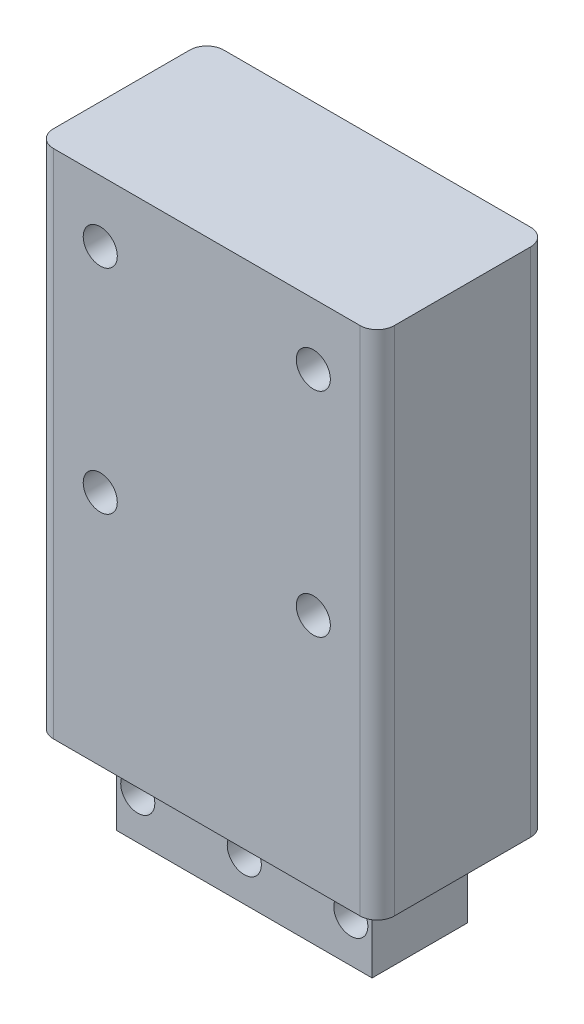
ISO-10303-21;
HEADER;
FILE_DESCRIPTION(('STEP AP214'),'2;1');
FILE_NAME('part.step','',(''),(''),'','','');
FILE_SCHEMA(('AUTOMOTIVE_DESIGN { 1 0 10303 214 1 1 1 1 }'));
ENDSEC;
DATA;
#1=APPLICATION_CONTEXT('core data for automotive mechanical design processes');
#2=APPLICATION_PROTOCOL_DEFINITION('international standard','automotive_design',2000,#1);
#3=PRODUCT_CONTEXT('',#1,'mechanical');
#4=PRODUCT('Part','Part','',(#3));
#5=PRODUCT_RELATED_PRODUCT_CATEGORY('part','',(#4));
#6=PRODUCT_DEFINITION_FORMATION('','',#4);
#7=PRODUCT_DEFINITION_CONTEXT('part definition',#1,'design');
#8=PRODUCT_DEFINITION('design','',#6,#7);
#9=PRODUCT_DEFINITION_SHAPE('','',#8);
#10=(LENGTH_UNIT() NAMED_UNIT(*) SI_UNIT(.MILLI.,.METRE.));
#11=(NAMED_UNIT(*) PLANE_ANGLE_UNIT() SI_UNIT($,.RADIAN.));
#12=(NAMED_UNIT(*) SI_UNIT($,.STERADIAN.) SOLID_ANGLE_UNIT());
#13=UNCERTAINTY_MEASURE_WITH_UNIT(LENGTH_MEASURE(1.E-05),#10,'distance_accuracy_value','');
#14=(GEOMETRIC_REPRESENTATION_CONTEXT(3) GLOBAL_UNCERTAINTY_ASSIGNED_CONTEXT((#13)) GLOBAL_UNIT_ASSIGNED_CONTEXT((#10,
#11,#12)) REPRESENTATION_CONTEXT('',''));
#15=CARTESIAN_POINT('',(0.,0.,0.));
#16=DIRECTION('',(0.,0.,1.));
#17=DIRECTION('',(1.,0.,0.));
#18=AXIS2_PLACEMENT_3D('',#15,#16,#17);
#19=CARTESIAN_POINT('',(-20.,-20.,-10.));
#20=DIRECTION('',(-1.,0.,0.));
#21=DIRECTION('',(0.,0.,1.));
#22=AXIS2_PLACEMENT_3D('',#19,#20,#21);
#23=PLANE('',#22);
#24=DIRECTION('',(0.,0.,1.));
#25=VECTOR('',#24,1.);
#26=CARTESIAN_POINT('',(-20.,-20.,-10.));
#27=LINE('',#26,#25);
#28=CARTESIAN_POINT('',(-20.,-20.,-8.));
#29=VERTEX_POINT('',#28);
#30=CARTESIAN_POINT('',(-20.,-20.,8.));
#31=VERTEX_POINT('',#30);
#32=EDGE_CURVE('E172',#29,#31,#27,.T.);
#33=ORIENTED_EDGE('',*,*,#32,.T.);
#34=DIRECTION('',(0.,1.,0.));
#35=VECTOR('',#34,1.);
#36=CARTESIAN_POINT('',(-20.,-20.,8.));
#37=LINE('',#36,#35);
#38=CARTESIAN_POINT('',(-20.,40.,8.));
#39=VERTEX_POINT('',#38);
#40=EDGE_CURVE('E11',#31,#39,#37,.T.);
#41=ORIENTED_EDGE('',*,*,#40,.T.);
#42=DIRECTION('',(0.,0.,1.));
#43=VECTOR('',#42,1.);
#44=CARTESIAN_POINT('',(-20.,40.,-9.99999999999999));
#45=LINE('',#44,#43);
#46=CARTESIAN_POINT('',(-20.,40.,-8.));
#47=VERTEX_POINT('',#46);
#48=EDGE_CURVE('E166',#47,#39,#45,.T.);
#49=ORIENTED_EDGE('',*,*,#48,.F.);
#50=DIRECTION('',(0.,1.,0.));
#51=VECTOR('',#50,1.);
#52=CARTESIAN_POINT('',(-20.,-20.,-8.));
#53=LINE('',#52,#51);
#54=EDGE_CURVE('E47',#47,#29,#53,.F.);
#55=ORIENTED_EDGE('',*,*,#54,.T.);
#56=EDGE_LOOP('',(#33,#41,#49,#55));
#57=FACE_BOUND('',#56,.T.);
#58=ADVANCED_FACE('F39',(#57),#23,.T.);
#59=CARTESIAN_POINT('',(20.,-20.,-10.));
#60=DIRECTION('',(0.,0.,-1.));
#61=DIRECTION('',(-1.,0.,0.));
#62=AXIS2_PLACEMENT_3D('',#59,#60,#61);
#63=PLANE('',#62);
#64=CARTESIAN_POINT('',(12.5,7.80084498848943,-10.));
#65=DIRECTION('',(0.,0.,-1.));
#66=DIRECTION('',(1.,0.,0.));
#67=AXIS2_PLACEMENT_3D('',#64,#65,#66);
#68=CIRCLE('',#67,2.00000000000001);
#69=CARTESIAN_POINT('',(14.5,7.80084498848943,-10.));
#70=VERTEX_POINT('',#69);
#71=EDGE_CURVE('E360',#70,#70,#68,.T.);
#72=ORIENTED_EDGE('',*,*,#71,.F.);
#73=EDGE_LOOP('',(#72));
#74=FACE_BOUND('',#73,.T.);
#75=CARTESIAN_POINT('',(12.5,32.8008449884894,-10.));
#76=DIRECTION('',(0.,0.,-1.));
#77=DIRECTION('',(1.,0.,0.));
#78=AXIS2_PLACEMENT_3D('',#75,#76,#77);
#79=CIRCLE('',#78,2.);
#80=CARTESIAN_POINT('',(14.5,32.8008449884894,-10.));
#81=VERTEX_POINT('',#80);
#82=EDGE_CURVE('E356',#81,#81,#79,.T.);
#83=ORIENTED_EDGE('',*,*,#82,.F.);
#84=EDGE_LOOP('',(#83));
#85=FACE_BOUND('',#84,.T.);
#86=CARTESIAN_POINT('',(-12.5,32.8008449884894,-10.));
#87=DIRECTION('',(0.,0.,-1.));
#88=DIRECTION('',(-1.,0.,0.));
#89=AXIS2_PLACEMENT_3D('',#86,#87,#88);
#90=CIRCLE('',#89,2.);
#91=CARTESIAN_POINT('',(-14.5,32.8008449884894,-10.));
#92=VERTEX_POINT('',#91);
#93=EDGE_CURVE('E353',#92,#92,#90,.T.);
#94=ORIENTED_EDGE('',*,*,#93,.F.);
#95=EDGE_LOOP('',(#94));
#96=FACE_BOUND('',#95,.T.);
#97=CARTESIAN_POINT('',(-12.5,7.80084498848943,-10.));
#98=DIRECTION('',(0.,0.,-1.));
#99=DIRECTION('',(-1.,0.,0.));
#100=AXIS2_PLACEMENT_3D('',#97,#98,#99);
#101=CIRCLE('',#100,2.00000000000001);
#102=CARTESIAN_POINT('',(-14.5,7.80084498848943,-10.));
#103=VERTEX_POINT('',#102);
#104=EDGE_CURVE('E201',#103,#103,#101,.T.);
#105=ORIENTED_EDGE('',*,*,#104,.F.);
#106=EDGE_LOOP('',(#105));
#107=FACE_BOUND('',#106,.T.);
#108=DIRECTION('',(-1.,0.,0.));
#109=VECTOR('',#108,1.);
#110=CARTESIAN_POINT('',(-20.,40.,-9.99999999999999));
#111=LINE('',#110,#109);
#112=CARTESIAN_POINT('',(18.,40.,-9.99999999999999));
#113=VERTEX_POINT('',#112);
#114=CARTESIAN_POINT('',(-18.,40.,-9.99999999999999));
#115=VERTEX_POINT('',#114);
#116=EDGE_CURVE('E158',#113,#115,#111,.T.);
#117=ORIENTED_EDGE('',*,*,#116,.F.);
#118=DIRECTION('',(0.,1.,0.));
#119=VECTOR('',#118,1.);
#120=CARTESIAN_POINT('',(18.,-20.,-10.));
#121=LINE('',#120,#119);
#122=CARTESIAN_POINT('',(18.,-20.,-10.));
#123=VERTEX_POINT('',#122);
#124=EDGE_CURVE('E224',#113,#123,#121,.F.);
#125=ORIENTED_EDGE('',*,*,#124,.T.);
#126=DIRECTION('',(-1.,0.,0.));
#127=VECTOR('',#126,1.);
#128=CARTESIAN_POINT('',(20.,-20.,-10.));
#129=LINE('',#128,#127);
#130=CARTESIAN_POINT('',(-18.,-20.,-10.));
#131=VERTEX_POINT('',#130);
#132=EDGE_CURVE('E180',#123,#131,#129,.T.);
#133=ORIENTED_EDGE('',*,*,#132,.T.);
#134=DIRECTION('',(0.,1.,0.));
#135=VECTOR('',#134,1.);
#136=CARTESIAN_POINT('',(-18.,-20.,-10.));
#137=LINE('',#136,#135);
#138=EDGE_CURVE('E221',#131,#115,#137,.T.);
#139=ORIENTED_EDGE('',*,*,#138,.T.);
#140=EDGE_LOOP('',(#117,#125,#133,#139));
#141=FACE_BOUND('',#140,.T.);
#142=ADVANCED_FACE('F249',(#74,#85,#96,#107,#141),#63,.T.);
#143=CARTESIAN_POINT('',(20.,-20.,-10.));
#144=DIRECTION('',(1.,0.,0.));
#145=DIRECTION('',(0.,0.,-1.));
#146=AXIS2_PLACEMENT_3D('',#143,#144,#145);
#147=PLANE('',#146);
#148=DIRECTION('',(0.,0.,-1.));
#149=VECTOR('',#148,1.);
#150=CARTESIAN_POINT('',(20.,-20.,-10.));
#151=LINE('',#150,#149);
#152=CARTESIAN_POINT('',(20.,-20.,7.99999999999999));
#153=VERTEX_POINT('',#152);
#154=CARTESIAN_POINT('',(20.,-20.,-8.00000000000001));
#155=VERTEX_POINT('',#154);
#156=EDGE_CURVE('E177',#153,#155,#151,.T.);
#157=ORIENTED_EDGE('',*,*,#156,.T.);
#158=DIRECTION('',(0.,1.,0.));
#159=VECTOR('',#158,1.);
#160=CARTESIAN_POINT('',(20.,-20.,-8.00000000000001));
#161=LINE('',#160,#159);
#162=CARTESIAN_POINT('',(20.,40.,-8.00000000000001));
#163=VERTEX_POINT('',#162);
#164=EDGE_CURVE('E210',#155,#163,#161,.T.);
#165=ORIENTED_EDGE('',*,*,#164,.T.);
#166=DIRECTION('',(0.,0.,-1.));
#167=VECTOR('',#166,1.);
#168=CARTESIAN_POINT('',(20.,40.,-9.99999999999999));
#169=LINE('',#168,#167);
#170=CARTESIAN_POINT('',(20.,40.,7.99999999999999));
#171=VERTEX_POINT('',#170);
#172=EDGE_CURVE('E155',#171,#163,#169,.T.);
#173=ORIENTED_EDGE('',*,*,#172,.F.);
#174=DIRECTION('',(0.,1.,0.));
#175=VECTOR('',#174,1.);
#176=CARTESIAN_POINT('',(20.,-20.,7.99999999999999));
#177=LINE('',#176,#175);
#178=EDGE_CURVE('E183',#171,#153,#177,.F.);
#179=ORIENTED_EDGE('',*,*,#178,.T.);
#180=EDGE_LOOP('',(#157,#165,#173,#179));
#181=FACE_BOUND('',#180,.T.);
#182=ADVANCED_FACE('F259',(#181),#147,.T.);
#183=CARTESIAN_POINT('',(20.,-20.,9.99999999999999));
#184=DIRECTION('',(0.,0.,1.));
#185=DIRECTION('',(1.,0.,0.));
#186=AXIS2_PLACEMENT_3D('',#183,#184,#185);
#187=PLANE('',#186);
#188=CARTESIAN_POINT('',(12.5,7.80084498848943,9.99999999999999));
#189=DIRECTION('',(0.,0.,1.));
#190=DIRECTION('',(1.,0.,0.));
#191=AXIS2_PLACEMENT_3D('',#188,#189,#190);
#192=CIRCLE('',#191,2.00000000000001);
#193=CARTESIAN_POINT('',(14.5,7.80084498848943,9.99999999999999));
#194=VERTEX_POINT('',#193);
#195=EDGE_CURVE('E188',#194,#194,#192,.T.);
#196=ORIENTED_EDGE('',*,*,#195,.F.);
#197=EDGE_LOOP('',(#196));
#198=FACE_BOUND('',#197,.T.);
#199=CARTESIAN_POINT('',(12.5,32.8008449884894,9.99999999999999));
#200=DIRECTION('',(0.,0.,1.));
#201=DIRECTION('',(1.,0.,0.));
#202=AXIS2_PLACEMENT_3D('',#199,#200,#201);
#203=CIRCLE('',#202,2.);
#204=CARTESIAN_POINT('',(14.5,32.8008449884894,9.99999999999999));
#205=VERTEX_POINT('',#204);
#206=EDGE_CURVE('E204',#205,#205,#203,.T.);
#207=ORIENTED_EDGE('',*,*,#206,.F.);
#208=EDGE_LOOP('',(#207));
#209=FACE_BOUND('',#208,.T.);
#210=CARTESIAN_POINT('',(-12.5,32.8008449884894,10.));
#211=DIRECTION('',(0.,0.,1.));
#212=DIRECTION('',(1.,0.,0.));
#213=AXIS2_PLACEMENT_3D('',#210,#211,#212);
#214=CIRCLE('',#213,2.);
#215=CARTESIAN_POINT('',(-10.5,32.8008449884894,10.));
#216=VERTEX_POINT('',#215);
#217=EDGE_CURVE('E200',#216,#216,#214,.T.);
#218=ORIENTED_EDGE('',*,*,#217,.F.);
#219=EDGE_LOOP('',(#218));
#220=FACE_BOUND('',#219,.T.);
#221=CARTESIAN_POINT('',(-12.5,7.80084498848943,10.));
#222=DIRECTION('',(0.,0.,1.));
#223=DIRECTION('',(1.,0.,0.));
#224=AXIS2_PLACEMENT_3D('',#221,#222,#223);
#225=CIRCLE('',#224,2.00000000000001);
#226=CARTESIAN_POINT('',(-10.5,7.80084498848943,10.));
#227=VERTEX_POINT('',#226);
#228=EDGE_CURVE('E197',#227,#227,#225,.T.);
#229=ORIENTED_EDGE('',*,*,#228,.F.);
#230=EDGE_LOOP('',(#229));
#231=FACE_BOUND('',#230,.T.);
#232=DIRECTION('',(1.,0.,0.));
#233=VECTOR('',#232,1.);
#234=CARTESIAN_POINT('',(20.,-20.,9.99999999999999));
#235=LINE('',#234,#233);
#236=CARTESIAN_POINT('',(-18.,-20.,10.));
#237=VERTEX_POINT('',#236);
#238=CARTESIAN_POINT('',(18.,-20.,9.99999999999999));
#239=VERTEX_POINT('',#238);
#240=EDGE_CURVE('E175',#237,#239,#235,.T.);
#241=ORIENTED_EDGE('',*,*,#240,.T.);
#242=DIRECTION('',(0.,1.,0.));
#243=VECTOR('',#242,1.);
#244=CARTESIAN_POINT('',(18.,-20.,9.99999999999999));
#245=LINE('',#244,#243);
#246=CARTESIAN_POINT('',(18.,40.,9.99999999999999));
#247=VERTEX_POINT('',#246);
#248=EDGE_CURVE('E234',#239,#247,#245,.T.);
#249=ORIENTED_EDGE('',*,*,#248,.T.);
#250=DIRECTION('',(1.,0.,0.));
#251=VECTOR('',#250,1.);
#252=CARTESIAN_POINT('',(-20.,40.,9.99999999999999));
#253=LINE('',#252,#251);
#254=CARTESIAN_POINT('',(-18.,40.,9.99999999999999));
#255=VERTEX_POINT('',#254);
#256=EDGE_CURVE('E169',#255,#247,#253,.T.);
#257=ORIENTED_EDGE('',*,*,#256,.F.);
#258=DIRECTION('',(0.,1.,0.));
#259=VECTOR('',#258,1.);
#260=CARTESIAN_POINT('',(-18.,-20.,10.));
#261=LINE('',#260,#259);
#262=EDGE_CURVE('E61',#255,#237,#261,.F.);
#263=ORIENTED_EDGE('',*,*,#262,.T.);
#264=EDGE_LOOP('',(#241,#249,#257,#263));
#265=FACE_BOUND('',#264,.T.);
#266=ADVANCED_FACE('F264',(#198,#209,#220,#231,#265),#187,.T.);
#267=CARTESIAN_POINT('',(0.,-20.,0.));
#268=DIRECTION('',(0.,-1.,0.));
#269=DIRECTION('',(0.,0.,-1.));
#270=AXIS2_PLACEMENT_3D('',#267,#268,#269);
#271=PLANE('',#270);
#272=DIRECTION('',(-1.,0.,0.));
#273=VECTOR('',#272,1.);
#274=CARTESIAN_POINT('',(15.,-20.,5.6));
#275=LINE('',#274,#273);
#276=CARTESIAN_POINT('',(15.,-20.,5.6));
#277=VERTEX_POINT('',#276);
#278=CARTESIAN_POINT('',(-15.,-20.,5.6));
#279=VERTEX_POINT('',#278);
#280=EDGE_CURVE('E154',#277,#279,#275,.T.);
#281=ORIENTED_EDGE('',*,*,#280,.F.);
#282=DIRECTION('',(0.,0.,1.));
#283=VECTOR('',#282,1.);
#284=CARTESIAN_POINT('',(15.,-20.,-5.6));
#285=LINE('',#284,#283);
#286=CARTESIAN_POINT('',(15.,-20.,-5.6));
#287=VERTEX_POINT('',#286);
#288=EDGE_CURVE('E151',#287,#277,#285,.T.);
#289=ORIENTED_EDGE('',*,*,#288,.F.);
#290=DIRECTION('',(1.,0.,0.));
#291=VECTOR('',#290,1.);
#292=CARTESIAN_POINT('',(-15.,-20.,-5.6));
#293=LINE('',#292,#291);
#294=CARTESIAN_POINT('',(-15.,-20.,-5.6));
#295=VERTEX_POINT('',#294);
#296=EDGE_CURVE('E374',#295,#287,#293,.T.);
#297=ORIENTED_EDGE('',*,*,#296,.F.);
#298=DIRECTION('',(0.,0.,-1.));
#299=VECTOR('',#298,1.);
#300=CARTESIAN_POINT('',(-15.,-20.,5.6));
#301=LINE('',#300,#299);
#302=EDGE_CURVE('E372',#279,#295,#301,.T.);
#303=ORIENTED_EDGE('',*,*,#302,.F.);
#304=EDGE_LOOP('',(#281,#289,#297,#303));
#305=FACE_BOUND('',#304,.T.);
#306=ORIENTED_EDGE('',*,*,#132,.F.);
#307=CARTESIAN_POINT('',(18.,-20.,-8.00000000000001));
#308=DIRECTION('',(0.,-1.,0.));
#309=DIRECTION('',(0.,0.,-1.));
#310=AXIS2_PLACEMENT_3D('',#307,#308,#309);
#311=CIRCLE('',#310,2.);
#312=EDGE_CURVE('E231',#123,#155,#311,.T.);
#313=ORIENTED_EDGE('',*,*,#312,.T.);
#314=ORIENTED_EDGE('',*,*,#156,.F.);
#315=CARTESIAN_POINT('',(18.,-20.,7.99999999999999));
#316=DIRECTION('',(0.,-1.,0.));
#317=DIRECTION('',(0.,0.,-1.));
#318=AXIS2_PLACEMENT_3D('',#315,#316,#317);
#319=CIRCLE('',#318,2.);
#320=EDGE_CURVE('E54',#153,#239,#319,.T.);
#321=ORIENTED_EDGE('',*,*,#320,.T.);
#322=ORIENTED_EDGE('',*,*,#240,.F.);
#323=CARTESIAN_POINT('',(-18.,-20.,8.));
#324=DIRECTION('',(0.,-1.,0.));
#325=DIRECTION('',(0.,0.,-1.));
#326=AXIS2_PLACEMENT_3D('',#323,#324,#325);
#327=CIRCLE('',#326,2.);
#328=EDGE_CURVE('E228',#237,#31,#327,.T.);
#329=ORIENTED_EDGE('',*,*,#328,.T.);
#330=ORIENTED_EDGE('',*,*,#32,.F.);
#331=CARTESIAN_POINT('',(-18.,-20.,-8.));
#332=DIRECTION('',(0.,-1.,0.));
#333=DIRECTION('',(0.,0.,-1.));
#334=AXIS2_PLACEMENT_3D('',#331,#332,#333);
#335=CIRCLE('',#334,2.);
#336=EDGE_CURVE('E226',#29,#131,#335,.T.);
#337=ORIENTED_EDGE('',*,*,#336,.T.);
#338=EDGE_LOOP('',(#306,#313,#314,#321,#322,#329,#330,#337));
#339=FACE_BOUND('',#338,.T.);
#340=ADVANCED_FACE('F244',(#305,#339),#271,.T.);
#341=CARTESIAN_POINT('',(0.,40.,0.));
#342=DIRECTION('',(0.,1.,0.));
#343=DIRECTION('',(0.,0.,1.));
#344=AXIS2_PLACEMENT_3D('',#341,#342,#343);
#345=PLANE('',#344);
#346=ORIENTED_EDGE('',*,*,#172,.T.);
#347=CARTESIAN_POINT('',(18.,40.,-8.00000000000001));
#348=DIRECTION('',(0.,1.,0.));
#349=DIRECTION('',(0.,0.,1.));
#350=AXIS2_PLACEMENT_3D('',#347,#348,#349);
#351=CIRCLE('',#350,2.);
#352=EDGE_CURVE('E219',#163,#113,#351,.T.);
#353=ORIENTED_EDGE('',*,*,#352,.T.);
#354=ORIENTED_EDGE('',*,*,#116,.T.);
#355=CARTESIAN_POINT('',(-18.,40.,-8.));
#356=DIRECTION('',(0.,1.,0.));
#357=DIRECTION('',(0.,0.,1.));
#358=AXIS2_PLACEMENT_3D('',#355,#356,#357);
#359=CIRCLE('',#358,2.);
#360=EDGE_CURVE('E213',#115,#47,#359,.T.);
#361=ORIENTED_EDGE('',*,*,#360,.T.);
#362=ORIENTED_EDGE('',*,*,#48,.T.);
#363=CARTESIAN_POINT('',(-18.,40.,8.));
#364=DIRECTION('',(0.,1.,0.));
#365=DIRECTION('',(0.,0.,1.));
#366=AXIS2_PLACEMENT_3D('',#363,#364,#365);
#367=CIRCLE('',#366,2.);
#368=EDGE_CURVE('E215',#39,#255,#367,.T.);
#369=ORIENTED_EDGE('',*,*,#368,.T.);
#370=ORIENTED_EDGE('',*,*,#256,.T.);
#371=CARTESIAN_POINT('',(18.,40.,7.99999999999999));
#372=DIRECTION('',(0.,1.,0.));
#373=DIRECTION('',(0.,0.,1.));
#374=AXIS2_PLACEMENT_3D('',#371,#372,#373);
#375=CIRCLE('',#374,2.);
#376=EDGE_CURVE('E217',#247,#171,#375,.T.);
#377=ORIENTED_EDGE('',*,*,#376,.T.);
#378=EDGE_LOOP('',(#346,#353,#354,#361,#362,#369,#370,#377));
#379=FACE_BOUND('',#378,.T.);
#380=ADVANCED_FACE('F252',(#379),#345,.T.);
#381=CARTESIAN_POINT('',(15.,-30.,5.6));
#382=DIRECTION('',(0.,0.,-1.));
#383=DIRECTION('',(-1.,0.,0.));
#384=AXIS2_PLACEMENT_3D('',#381,#382,#383);
#385=PLANE('',#384);
#386=CARTESIAN_POINT('',(12.5,-25.,5.6));
#387=DIRECTION('',(0.,0.,-1.));
#388=DIRECTION('',(-1.,0.,0.));
#389=AXIS2_PLACEMENT_3D('',#386,#387,#388);
#390=CIRCLE('',#389,2.);
#391=CARTESIAN_POINT('',(10.5,-25.,5.6));
#392=VERTEX_POINT('',#391);
#393=EDGE_CURVE('E196',#392,#392,#390,.T.);
#394=ORIENTED_EDGE('',*,*,#393,.T.);
#395=EDGE_LOOP('',(#394));
#396=FACE_BOUND('',#395,.T.);
#397=CARTESIAN_POINT('',(-12.5,-25.,5.6));
#398=DIRECTION('',(0.,0.,-1.));
#399=DIRECTION('',(-1.,0.,0.));
#400=AXIS2_PLACEMENT_3D('',#397,#398,#399);
#401=CIRCLE('',#400,2.);
#402=CARTESIAN_POINT('',(-14.5,-25.,5.6));
#403=VERTEX_POINT('',#402);
#404=EDGE_CURVE('E192',#403,#403,#401,.T.);
#405=ORIENTED_EDGE('',*,*,#404,.T.);
#406=EDGE_LOOP('',(#405));
#407=FACE_BOUND('',#406,.T.);
#408=CARTESIAN_POINT('',(0.,-25.,5.6));
#409=DIRECTION('',(0.,0.,-1.));
#410=DIRECTION('',(-1.,0.,0.));
#411=AXIS2_PLACEMENT_3D('',#408,#409,#410);
#412=CIRCLE('',#411,2.);
#413=CARTESIAN_POINT('',(-2.,-25.,5.6));
#414=VERTEX_POINT('',#413);
#415=EDGE_CURVE('E187',#414,#414,#412,.T.);
#416=ORIENTED_EDGE('',*,*,#415,.T.);
#417=EDGE_LOOP('',(#416));
#418=FACE_BOUND('',#417,.T.);
#419=ORIENTED_EDGE('',*,*,#280,.T.);
#420=DIRECTION('',(0.,1.,0.));
#421=VECTOR('',#420,1.);
#422=CARTESIAN_POINT('',(-15.,-30.,5.6));
#423=LINE('',#422,#421);
#424=CARTESIAN_POINT('',(-15.,-30.,5.6));
#425=VERTEX_POINT('',#424);
#426=EDGE_CURVE('E135',#425,#279,#423,.T.);
#427=ORIENTED_EDGE('',*,*,#426,.F.);
#428=DIRECTION('',(-1.,0.,0.));
#429=VECTOR('',#428,1.);
#430=CARTESIAN_POINT('',(15.,-30.,5.6));
#431=LINE('',#430,#429);
#432=CARTESIAN_POINT('',(15.,-30.,5.6));
#433=VERTEX_POINT('',#432);
#434=EDGE_CURVE('E142',#433,#425,#431,.T.);
#435=ORIENTED_EDGE('',*,*,#434,.F.);
#436=DIRECTION('',(0.,1.,0.));
#437=VECTOR('',#436,1.);
#438=CARTESIAN_POINT('',(15.,-30.,5.6));
#439=LINE('',#438,#437);
#440=EDGE_CURVE('E370',#433,#277,#439,.T.);
#441=ORIENTED_EDGE('',*,*,#440,.T.);
#442=EDGE_LOOP('',(#419,#427,#435,#441));
#443=FACE_BOUND('',#442,.T.);
#444=ADVANCED_FACE('F153',(#396,#407,#418,#443),#385,.F.);
#445=CARTESIAN_POINT('',(-15.,-30.,5.6));
#446=DIRECTION('',(1.,0.,0.));
#447=DIRECTION('',(0.,0.,-1.));
#448=AXIS2_PLACEMENT_3D('',#445,#446,#447);
#449=PLANE('',#448);
#450=ORIENTED_EDGE('',*,*,#302,.T.);
#451=DIRECTION('',(0.,1.,0.));
#452=VECTOR('',#451,1.);
#453=CARTESIAN_POINT('',(-15.,-30.,-5.6));
#454=LINE('',#453,#452);
#455=CARTESIAN_POINT('',(-15.,-30.,-5.6));
#456=VERTEX_POINT('',#455);
#457=EDGE_CURVE('E138',#456,#295,#454,.T.);
#458=ORIENTED_EDGE('',*,*,#457,.F.);
#459=DIRECTION('',(0.,0.,-1.));
#460=VECTOR('',#459,1.);
#461=CARTESIAN_POINT('',(-15.,-30.,5.6));
#462=LINE('',#461,#460);
#463=EDGE_CURVE('E130',#425,#456,#462,.T.);
#464=ORIENTED_EDGE('',*,*,#463,.F.);
#465=ORIENTED_EDGE('',*,*,#426,.T.);
#466=EDGE_LOOP('',(#450,#458,#464,#465));
#467=FACE_BOUND('',#466,.T.);
#468=ADVANCED_FACE('F133',(#467),#449,.F.);
#469=CARTESIAN_POINT('',(-15.,-30.,-5.6));
#470=DIRECTION('',(0.,0.,1.));
#471=DIRECTION('',(1.,0.,0.));
#472=AXIS2_PLACEMENT_3D('',#469,#470,#471);
#473=PLANE('',#472);
#474=CARTESIAN_POINT('',(12.5,-25.,-5.6));
#475=DIRECTION('',(0.,0.,1.));
#476=DIRECTION('',(1.,0.,0.));
#477=AXIS2_PLACEMENT_3D('',#474,#475,#476);
#478=CIRCLE('',#477,2.);
#479=CARTESIAN_POINT('',(14.5,-25.,-5.6));
#480=VERTEX_POINT('',#479);
#481=EDGE_CURVE('E193',#480,#480,#478,.T.);
#482=ORIENTED_EDGE('',*,*,#481,.T.);
#483=EDGE_LOOP('',(#482));
#484=FACE_BOUND('',#483,.T.);
#485=CARTESIAN_POINT('',(-12.5,-25.,-5.6));
#486=DIRECTION('',(0.,0.,1.));
#487=DIRECTION('',(1.,0.,0.));
#488=AXIS2_PLACEMENT_3D('',#485,#486,#487);
#489=CIRCLE('',#488,2.);
#490=CARTESIAN_POINT('',(-10.5,-25.,-5.6));
#491=VERTEX_POINT('',#490);
#492=EDGE_CURVE('E189',#491,#491,#489,.T.);
#493=ORIENTED_EDGE('',*,*,#492,.T.);
#494=EDGE_LOOP('',(#493));
#495=FACE_BOUND('',#494,.T.);
#496=CARTESIAN_POINT('',(0.,-25.,-5.6));
#497=DIRECTION('',(0.,0.,1.));
#498=DIRECTION('',(1.,0.,0.));
#499=AXIS2_PLACEMENT_3D('',#496,#497,#498);
#500=CIRCLE('',#499,2.);
#501=CARTESIAN_POINT('',(2.,-25.,-5.6));
#502=VERTEX_POINT('',#501);
#503=EDGE_CURVE('E184',#502,#502,#500,.T.);
#504=ORIENTED_EDGE('',*,*,#503,.T.);
#505=EDGE_LOOP('',(#504));
#506=FACE_BOUND('',#505,.T.);
#507=ORIENTED_EDGE('',*,*,#296,.T.);
#508=DIRECTION('',(0.,1.,0.));
#509=VECTOR('',#508,1.);
#510=CARTESIAN_POINT('',(15.,-30.,-5.6));
#511=LINE('',#510,#509);
#512=CARTESIAN_POINT('',(15.,-30.,-5.6));
#513=VERTEX_POINT('',#512);
#514=EDGE_CURVE('E160',#513,#287,#511,.T.);
#515=ORIENTED_EDGE('',*,*,#514,.F.);
#516=DIRECTION('',(1.,0.,0.));
#517=VECTOR('',#516,1.);
#518=CARTESIAN_POINT('',(-15.,-30.,-5.6));
#519=LINE('',#518,#517);
#520=EDGE_CURVE('E141',#456,#513,#519,.T.);
#521=ORIENTED_EDGE('',*,*,#520,.F.);
#522=ORIENTED_EDGE('',*,*,#457,.T.);
#523=EDGE_LOOP('',(#507,#515,#521,#522));
#524=FACE_BOUND('',#523,.T.);
#525=ADVANCED_FACE('F322',(#484,#495,#506,#524),#473,.F.);
#526=CARTESIAN_POINT('',(15.,-30.,-5.6));
#527=DIRECTION('',(-1.,0.,0.));
#528=DIRECTION('',(0.,0.,1.));
#529=AXIS2_PLACEMENT_3D('',#526,#527,#528);
#530=PLANE('',#529);
#531=ORIENTED_EDGE('',*,*,#288,.T.);
#532=ORIENTED_EDGE('',*,*,#440,.F.);
#533=DIRECTION('',(0.,0.,1.));
#534=VECTOR('',#533,1.);
#535=CARTESIAN_POINT('',(15.,-30.,-5.6));
#536=LINE('',#535,#534);
#537=EDGE_CURVE('E147',#513,#433,#536,.T.);
#538=ORIENTED_EDGE('',*,*,#537,.F.);
#539=ORIENTED_EDGE('',*,*,#514,.T.);
#540=EDGE_LOOP('',(#531,#532,#538,#539));
#541=FACE_BOUND('',#540,.T.);
#542=ADVANCED_FACE('F319',(#541),#530,.F.);
#543=CARTESIAN_POINT('',(0.,-30.,0.));
#544=DIRECTION('',(0.,-1.,0.));
#545=DIRECTION('',(0.,0.,-1.));
#546=AXIS2_PLACEMENT_3D('',#543,#544,#545);
#547=PLANE('',#546);
#548=ORIENTED_EDGE('',*,*,#434,.T.);
#549=ORIENTED_EDGE('',*,*,#463,.T.);
#550=ORIENTED_EDGE('',*,*,#520,.T.);
#551=ORIENTED_EDGE('',*,*,#537,.T.);
#552=EDGE_LOOP('',(#548,#549,#550,#551));
#553=FACE_BOUND('',#552,.T.);
#554=ADVANCED_FACE('F145',(#553),#547,.T.);
#555=CARTESIAN_POINT('',(0.,-25.,29.4));
#556=DIRECTION('',(0.,0.,-1.));
#557=DIRECTION('',(-1.,0.,0.));
#558=AXIS2_PLACEMENT_3D('',#555,#556,#557);
#559=CYLINDRICAL_SURFACE('',#558,2.);
#560=ORIENTED_EDGE('',*,*,#503,.F.);
#561=EDGE_LOOP('',(#560));
#562=FACE_BOUND('',#561,.T.);
#563=ORIENTED_EDGE('',*,*,#415,.F.);
#564=EDGE_LOOP('',(#563));
#565=FACE_BOUND('',#564,.T.);
#566=ADVANCED_FACE('F309',(#562,#565),#559,.F.);
#567=CARTESIAN_POINT('',(-12.5,-25.,29.4));
#568=DIRECTION('',(0.,0.,-1.));
#569=DIRECTION('',(-1.,0.,0.));
#570=AXIS2_PLACEMENT_3D('',#567,#568,#569);
#571=CYLINDRICAL_SURFACE('',#570,2.);
#572=ORIENTED_EDGE('',*,*,#492,.F.);
#573=EDGE_LOOP('',(#572));
#574=FACE_BOUND('',#573,.T.);
#575=ORIENTED_EDGE('',*,*,#404,.F.);
#576=EDGE_LOOP('',(#575));
#577=FACE_BOUND('',#576,.T.);
#578=ADVANCED_FACE('F306',(#574,#577),#571,.F.);
#579=CARTESIAN_POINT('',(12.5,-25.,29.4));
#580=DIRECTION('',(0.,0.,-1.));
#581=DIRECTION('',(-1.,0.,0.));
#582=AXIS2_PLACEMENT_3D('',#579,#580,#581);
#583=CYLINDRICAL_SURFACE('',#582,2.);
#584=ORIENTED_EDGE('',*,*,#481,.F.);
#585=EDGE_LOOP('',(#584));
#586=FACE_BOUND('',#585,.T.);
#587=ORIENTED_EDGE('',*,*,#393,.F.);
#588=EDGE_LOOP('',(#587));
#589=FACE_BOUND('',#588,.T.);
#590=ADVANCED_FACE('F304',(#586,#589),#583,.F.);
#591=CARTESIAN_POINT('',(-12.5,7.80084498848943,25.));
#592=DIRECTION('',(0.,0.,-1.));
#593=DIRECTION('',(-1.,0.,0.));
#594=AXIS2_PLACEMENT_3D('',#591,#592,#593);
#595=CYLINDRICAL_SURFACE('',#594,2.00000000000001);
#596=ORIENTED_EDGE('',*,*,#228,.T.);
#597=EDGE_LOOP('',(#596));
#598=FACE_BOUND('',#597,.T.);
#599=ORIENTED_EDGE('',*,*,#104,.T.);
#600=EDGE_LOOP('',(#599));
#601=FACE_BOUND('',#600,.T.);
#602=ADVANCED_FACE('F301',(#598,#601),#595,.F.);
#603=CARTESIAN_POINT('',(-12.5,32.8008449884894,25.));
#604=DIRECTION('',(0.,0.,-1.));
#605=DIRECTION('',(-1.,0.,0.));
#606=AXIS2_PLACEMENT_3D('',#603,#604,#605);
#607=CYLINDRICAL_SURFACE('',#606,2.);
#608=ORIENTED_EDGE('',*,*,#217,.T.);
#609=EDGE_LOOP('',(#608));
#610=FACE_BOUND('',#609,.T.);
#611=ORIENTED_EDGE('',*,*,#93,.T.);
#612=EDGE_LOOP('',(#611));
#613=FACE_BOUND('',#612,.T.);
#614=ADVANCED_FACE('F295',(#610,#613),#607,.F.);
#615=CARTESIAN_POINT('',(12.5,32.8008449884894,25.));
#616=DIRECTION('',(0.,0.,-1.));
#617=DIRECTION('',(-1.,0.,0.));
#618=AXIS2_PLACEMENT_3D('',#615,#616,#617);
#619=CYLINDRICAL_SURFACE('',#618,2.);
#620=ORIENTED_EDGE('',*,*,#206,.T.);
#621=EDGE_LOOP('',(#620));
#622=FACE_BOUND('',#621,.T.);
#623=ORIENTED_EDGE('',*,*,#82,.T.);
#624=EDGE_LOOP('',(#623));
#625=FACE_BOUND('',#624,.T.);
#626=ADVANCED_FACE('F289',(#622,#625),#619,.F.);
#627=CARTESIAN_POINT('',(12.5,7.80084498848943,25.));
#628=DIRECTION('',(0.,0.,-1.));
#629=DIRECTION('',(-1.,0.,0.));
#630=AXIS2_PLACEMENT_3D('',#627,#628,#629);
#631=CYLINDRICAL_SURFACE('',#630,2.00000000000001);
#632=ORIENTED_EDGE('',*,*,#195,.T.);
#633=EDGE_LOOP('',(#632));
#634=FACE_BOUND('',#633,.T.);
#635=ORIENTED_EDGE('',*,*,#71,.T.);
#636=EDGE_LOOP('',(#635));
#637=FACE_BOUND('',#636,.T.);
#638=ADVANCED_FACE('F285',(#634,#637),#631,.F.);
#639=CARTESIAN_POINT('',(18.,-20.,-8.00000000000001));
#640=DIRECTION('',(0.,1.,0.));
#641=DIRECTION('',(0.,0.,1.));
#642=AXIS2_PLACEMENT_3D('',#639,#640,#641);
#643=CYLINDRICAL_SURFACE('',#642,2.);
#644=ORIENTED_EDGE('',*,*,#312,.F.);
#645=ORIENTED_EDGE('',*,*,#124,.F.);
#646=ORIENTED_EDGE('',*,*,#352,.F.);
#647=ORIENTED_EDGE('',*,*,#164,.F.);
#648=EDGE_LOOP('',(#644,#645,#646,#647));
#649=FACE_BOUND('',#648,.T.);
#650=ADVANCED_FACE('F257',(#649),#643,.T.);
#651=CARTESIAN_POINT('',(18.,-20.,7.99999999999999));
#652=DIRECTION('',(0.,1.,0.));
#653=DIRECTION('',(0.,0.,1.));
#654=AXIS2_PLACEMENT_3D('',#651,#652,#653);
#655=CYLINDRICAL_SURFACE('',#654,2.);
#656=ORIENTED_EDGE('',*,*,#320,.F.);
#657=ORIENTED_EDGE('',*,*,#178,.F.);
#658=ORIENTED_EDGE('',*,*,#376,.F.);
#659=ORIENTED_EDGE('',*,*,#248,.F.);
#660=EDGE_LOOP('',(#656,#657,#658,#659));
#661=FACE_BOUND('',#660,.T.);
#662=ADVANCED_FACE('F263',(#661),#655,.T.);
#663=CARTESIAN_POINT('',(-18.,-20.,8.));
#664=DIRECTION('',(0.,1.,0.));
#665=DIRECTION('',(0.,0.,1.));
#666=AXIS2_PLACEMENT_3D('',#663,#664,#665);
#667=CYLINDRICAL_SURFACE('',#666,2.);
#668=ORIENTED_EDGE('',*,*,#328,.F.);
#669=ORIENTED_EDGE('',*,*,#262,.F.);
#670=ORIENTED_EDGE('',*,*,#368,.F.);
#671=ORIENTED_EDGE('',*,*,#40,.F.);
#672=EDGE_LOOP('',(#668,#669,#670,#671));
#673=FACE_BOUND('',#672,.T.);
#674=ADVANCED_FACE('F266',(#673),#667,.T.);
#675=CARTESIAN_POINT('',(-18.,-20.,-8.));
#676=DIRECTION('',(0.,1.,0.));
#677=DIRECTION('',(0.,0.,1.));
#678=AXIS2_PLACEMENT_3D('',#675,#676,#677);
#679=CYLINDRICAL_SURFACE('',#678,2.);
#680=ORIENTED_EDGE('',*,*,#336,.F.);
#681=ORIENTED_EDGE('',*,*,#54,.F.);
#682=ORIENTED_EDGE('',*,*,#360,.F.);
#683=ORIENTED_EDGE('',*,*,#138,.F.);
#684=EDGE_LOOP('',(#680,#681,#682,#683));
#685=FACE_BOUND('',#684,.T.);
#686=ADVANCED_FACE('F41',(#685),#679,.T.);
#687=CLOSED_SHELL('',(#58,#142,#182,#266,#340,#380,#444,#468,#525,#542,#554,#566,#578,#590,#602,
#614,#626,#638,#650,#662,#674,#686));
#688=MANIFOLD_SOLID_BREP('B2',#687);
#689=ADVANCED_BREP_SHAPE_REPRESENTATION('',(#18,#688),#14);
#690=SHAPE_DEFINITION_REPRESENTATION(#9,#689);
ENDSEC;
END-ISO-10303-21;
